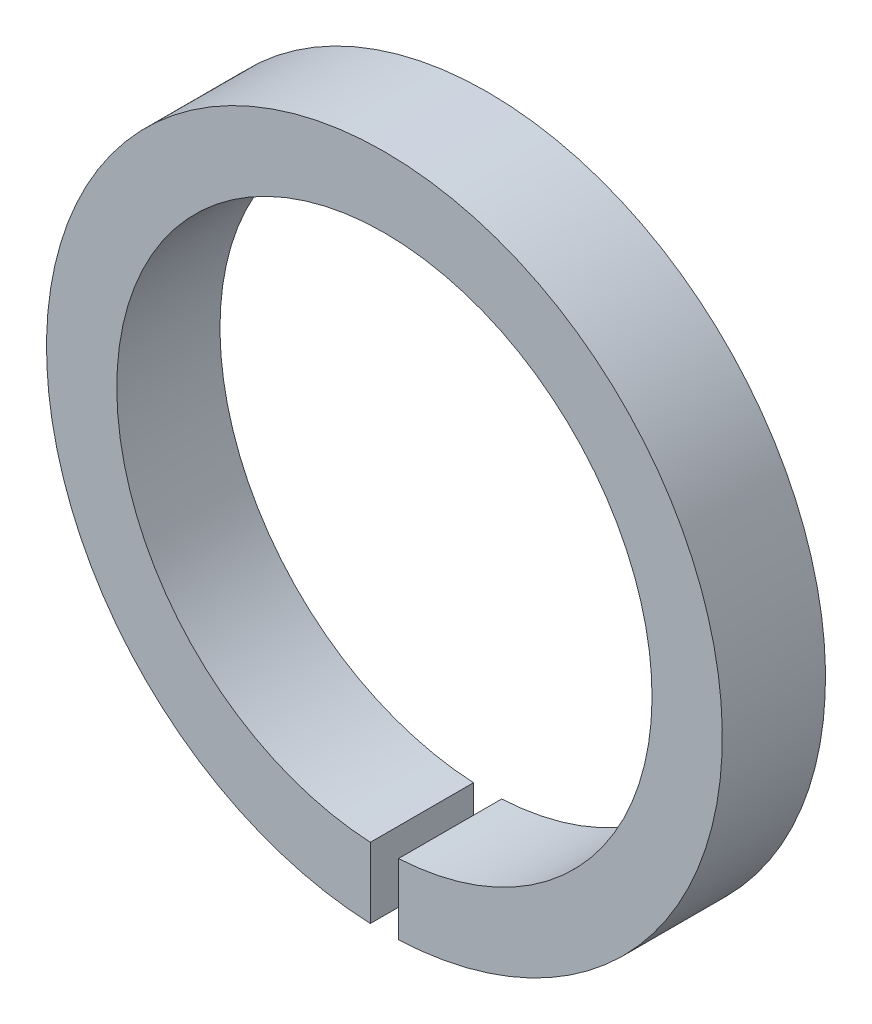
ISO-10303-21;
HEADER;
FILE_DESCRIPTION(('STEP AP214'),'2;1');
FILE_NAME('part.step','',(''),(''),'','','');
FILE_SCHEMA(('AUTOMOTIVE_DESIGN { 1 0 10303 214 1 1 1 1 }'));
ENDSEC;
DATA;
#1=APPLICATION_CONTEXT('core data for automotive mechanical design processes');
#2=APPLICATION_PROTOCOL_DEFINITION('international standard','automotive_design',2000,#1);
#3=PRODUCT_CONTEXT('',#1,'mechanical');
#4=PRODUCT('Part','Part','',(#3));
#5=PRODUCT_RELATED_PRODUCT_CATEGORY('part','',(#4));
#6=PRODUCT_DEFINITION_FORMATION('','',#4);
#7=PRODUCT_DEFINITION_CONTEXT('part definition',#1,'design');
#8=PRODUCT_DEFINITION('design','',#6,#7);
#9=PRODUCT_DEFINITION_SHAPE('','',#8);
#10=(LENGTH_UNIT() NAMED_UNIT(*) SI_UNIT(.MILLI.,.METRE.));
#11=(NAMED_UNIT(*) PLANE_ANGLE_UNIT() SI_UNIT($,.RADIAN.));
#12=(NAMED_UNIT(*) SI_UNIT($,.STERADIAN.) SOLID_ANGLE_UNIT());
#13=UNCERTAINTY_MEASURE_WITH_UNIT(LENGTH_MEASURE(1.E-05),#10,'distance_accuracy_value','');
#14=(GEOMETRIC_REPRESENTATION_CONTEXT(3) GLOBAL_UNCERTAINTY_ASSIGNED_CONTEXT((#13)) GLOBAL_UNIT_ASSIGNED_CONTEXT((#10,
#11,#12)) REPRESENTATION_CONTEXT('',''));
#15=CARTESIAN_POINT('',(0.,0.,0.));
#16=DIRECTION('',(0.,0.,1.));
#17=DIRECTION('',(1.,0.,0.));
#18=AXIS2_PLACEMENT_3D('',#15,#16,#17);
#19=CARTESIAN_POINT('',(0.,0.,0.));
#20=DIRECTION('',(0.,0.,1.));
#21=DIRECTION('',(0.,-1.,0.));
#22=AXIS2_PLACEMENT_3D('',#19,#20,#21);
#23=PLANE('',#22);
#24=DIRECTION('',(0.,-1.,0.));
#25=VECTOR('',#24,1.);
#26=CARTESIAN_POINT('',(-0.793749999999902,-15.0667061661632,0.));
#27=LINE('',#26,#25);
#28=CARTESIAN_POINT('',(-0.793749999999902,-15.0667061661632,0.));
#29=VERTEX_POINT('',#28);
#30=CARTESIAN_POINT('',(-0.793749999999904,-19.0334563581473,0.));
#31=VERTEX_POINT('',#30);
#32=EDGE_CURVE('E77',#29,#31,#27,.T.);
#33=ORIENTED_EDGE('',*,*,#32,.T.);
#34=CARTESIAN_POINT('',(0.,0.,0.));
#35=DIRECTION('',(0.,0.,-1.));
#36=DIRECTION('',(0.,1.,0.));
#37=AXIS2_PLACEMENT_3D('',#34,#35,#36);
#38=CIRCLE('',#37,19.05);
#39=CARTESIAN_POINT('',(0.793750000000088,-19.0334563581473,0.));
#40=VERTEX_POINT('',#39);
#41=EDGE_CURVE('E66',#40,#31,#38,.F.);
#42=ORIENTED_EDGE('',*,*,#41,.F.);
#43=DIRECTION('',(0.,1.,0.));
#44=VECTOR('',#43,1.);
#45=CARTESIAN_POINT('',(0.793750000000099,-15.0667061661631,0.));
#46=LINE('',#45,#44);
#47=CARTESIAN_POINT('',(0.793750000000099,-15.0667061661632,1.38777878078145E-13));
#48=VERTEX_POINT('',#47);
#49=EDGE_CURVE('E65',#40,#48,#46,.T.);
#50=ORIENTED_EDGE('',*,*,#49,.T.);
#51=CARTESIAN_POINT('',(0.,0.,2.4980018054066E-13));
#52=DIRECTION('',(0.,0.,-1.));
#53=DIRECTION('',(0.,1.,0.));
#54=AXIS2_PLACEMENT_3D('',#51,#52,#53);
#55=CIRCLE('',#54,15.0876);
#56=EDGE_CURVE('E19',#48,#29,#55,.F.);
#57=ORIENTED_EDGE('',*,*,#56,.T.);
#58=EDGE_LOOP('',(#33,#42,#50,#57));
#59=FACE_BOUND('',#58,.T.);
#60=ADVANCED_FACE('F16',(#59),#23,.F.);
#61=CARTESIAN_POINT('',(0.,0.,5.8166));
#62=DIRECTION('',(0.,0.,-1.));
#63=DIRECTION('',(0.,1.,0.));
#64=AXIS2_PLACEMENT_3D('',#61,#62,#63);
#65=CYLINDRICAL_SURFACE('',#64,15.0876);
#66=DIRECTION('',(0.,0.,1.));
#67=VECTOR('',#66,1.);
#68=CARTESIAN_POINT('',(0.793750000000099,-15.0667061661632,5.81660000000023));
#69=LINE('',#68,#67);
#70=CARTESIAN_POINT('',(0.793750000000099,-15.0667061661632,5.8166));
#71=VERTEX_POINT('',#70);
#72=EDGE_CURVE('E57',#48,#71,#69,.T.);
#73=ORIENTED_EDGE('',*,*,#72,.T.);
#74=CARTESIAN_POINT('',(0.,0.,5.81660000000003));
#75=DIRECTION('',(0.,0.,-1.));
#76=DIRECTION('',(0.,1.,0.));
#77=AXIS2_PLACEMENT_3D('',#74,#75,#76);
#78=CIRCLE('',#77,15.0876);
#79=CARTESIAN_POINT('',(-0.793749999999938,-15.0667061661632,5.81660000000003));
#80=VERTEX_POINT('',#79);
#81=EDGE_CURVE('E78',#80,#71,#78,.T.);
#82=ORIENTED_EDGE('',*,*,#81,.F.);
#83=DIRECTION('',(0.,0.,1.));
#84=VECTOR('',#83,1.);
#85=CARTESIAN_POINT('',(-0.793749999999902,-15.0667061661632,5.81660000000003));
#86=LINE('',#85,#84);
#87=EDGE_CURVE('E60',#80,#29,#86,.F.);
#88=ORIENTED_EDGE('',*,*,#87,.T.);
#89=ORIENTED_EDGE('',*,*,#56,.F.);
#90=EDGE_LOOP('',(#73,#82,#88,#89));
#91=FACE_BOUND('',#90,.T.);
#92=ADVANCED_FACE('F55',(#91),#65,.F.);
#93=CARTESIAN_POINT('',(0.793750000000099,-15.0667061661631,5.81660000000023));
#94=DIRECTION('',(1.,0.,0.));
#95=DIRECTION('',(0.,1.,0.));
#96=AXIS2_PLACEMENT_3D('',#93,#94,#95);
#97=PLANE('',#96);
#98=DIRECTION('',(0.,0.,-1.));
#99=VECTOR('',#98,1.);
#100=CARTESIAN_POINT('',(0.793750000000082,-19.0334563581473,5.8166));
#101=LINE('',#100,#99);
#102=CARTESIAN_POINT('',(0.793750000000091,-19.0334563581473,5.8166));
#103=VERTEX_POINT('',#102);
#104=EDGE_CURVE('E69',#103,#40,#101,.T.);
#105=ORIENTED_EDGE('',*,*,#104,.F.);
#106=DIRECTION('',(0.,-1.,0.));
#107=VECTOR('',#106,1.);
#108=CARTESIAN_POINT('',(0.793750000000099,0.,5.8166));
#109=LINE('',#108,#107);
#110=EDGE_CURVE('E72',#71,#103,#109,.T.);
#111=ORIENTED_EDGE('',*,*,#110,.F.);
#112=ORIENTED_EDGE('',*,*,#72,.F.);
#113=ORIENTED_EDGE('',*,*,#49,.F.);
#114=EDGE_LOOP('',(#105,#111,#112,#113));
#115=FACE_BOUND('',#114,.T.);
#116=ADVANCED_FACE('F71',(#115),#97,.F.);
#117=CARTESIAN_POINT('',(0.,0.,5.8166));
#118=DIRECTION('',(0.,0.,-1.));
#119=DIRECTION('',(0.,1.,0.));
#120=AXIS2_PLACEMENT_3D('',#117,#118,#119);
#121=CYLINDRICAL_SURFACE('',#120,19.05);
#122=ORIENTED_EDGE('',*,*,#41,.T.);
#123=DIRECTION('',(0.,0.,1.));
#124=VECTOR('',#123,1.);
#125=CARTESIAN_POINT('',(-0.793749999999904,-19.0334563581473,5.81660000000003));
#126=LINE('',#125,#124);
#127=CARTESIAN_POINT('',(-0.793749999999938,-19.0334563581473,5.8166));
#128=VERTEX_POINT('',#127);
#129=EDGE_CURVE('E81',#31,#128,#126,.T.);
#130=ORIENTED_EDGE('',*,*,#129,.T.);
#131=CARTESIAN_POINT('',(0.,0.,5.8166));
#132=DIRECTION('',(0.,0.,-1.));
#133=DIRECTION('',(0.,1.,0.));
#134=AXIS2_PLACEMENT_3D('',#131,#132,#133);
#135=CIRCLE('',#134,19.05);
#136=EDGE_CURVE('E25',#103,#128,#135,.F.);
#137=ORIENTED_EDGE('',*,*,#136,.F.);
#138=ORIENTED_EDGE('',*,*,#104,.T.);
#139=EDGE_LOOP('',(#122,#130,#137,#138));
#140=FACE_BOUND('',#139,.T.);
#141=ADVANCED_FACE('F84',(#140),#121,.T.);
#142=CARTESIAN_POINT('',(-0.793749999999902,-15.0667061661632,5.81660000000003));
#143=DIRECTION('',(-1.,0.,0.));
#144=DIRECTION('',(0.,-1.,0.));
#145=AXIS2_PLACEMENT_3D('',#142,#143,#144);
#146=PLANE('',#145);
#147=ORIENTED_EDGE('',*,*,#87,.F.);
#148=DIRECTION('',(0.,-1.,0.));
#149=VECTOR('',#148,1.);
#150=CARTESIAN_POINT('',(-0.793749999999973,0.,5.8166));
#151=LINE('',#150,#149);
#152=EDGE_CURVE('E11',#128,#80,#151,.F.);
#153=ORIENTED_EDGE('',*,*,#152,.F.);
#154=ORIENTED_EDGE('',*,*,#129,.F.);
#155=ORIENTED_EDGE('',*,*,#32,.F.);
#156=EDGE_LOOP('',(#147,#153,#154,#155));
#157=FACE_BOUND('',#156,.T.);
#158=ADVANCED_FACE('F90',(#157),#146,.F.);
#159=CARTESIAN_POINT('',(0.,0.,5.8166));
#160=DIRECTION('',(0.,0.,1.));
#161=DIRECTION('',(0.,-1.,0.));
#162=AXIS2_PLACEMENT_3D('',#159,#160,#161);
#163=PLANE('',#162);
#164=ORIENTED_EDGE('',*,*,#136,.T.);
#165=ORIENTED_EDGE('',*,*,#152,.T.);
#166=ORIENTED_EDGE('',*,*,#81,.T.);
#167=ORIENTED_EDGE('',*,*,#110,.T.);
#168=EDGE_LOOP('',(#164,#165,#166,#167));
#169=FACE_BOUND('',#168,.T.);
#170=ADVANCED_FACE('F87',(#169),#163,.T.);
#171=CLOSED_SHELL('',(#60,#92,#116,#141,#158,#170));
#172=MANIFOLD_SOLID_BREP('B1',#171);
#173=ADVANCED_BREP_SHAPE_REPRESENTATION('',(#18,#172),#14);
#174=SHAPE_DEFINITION_REPRESENTATION(#9,#173);
ENDSEC;
END-ISO-10303-21;
